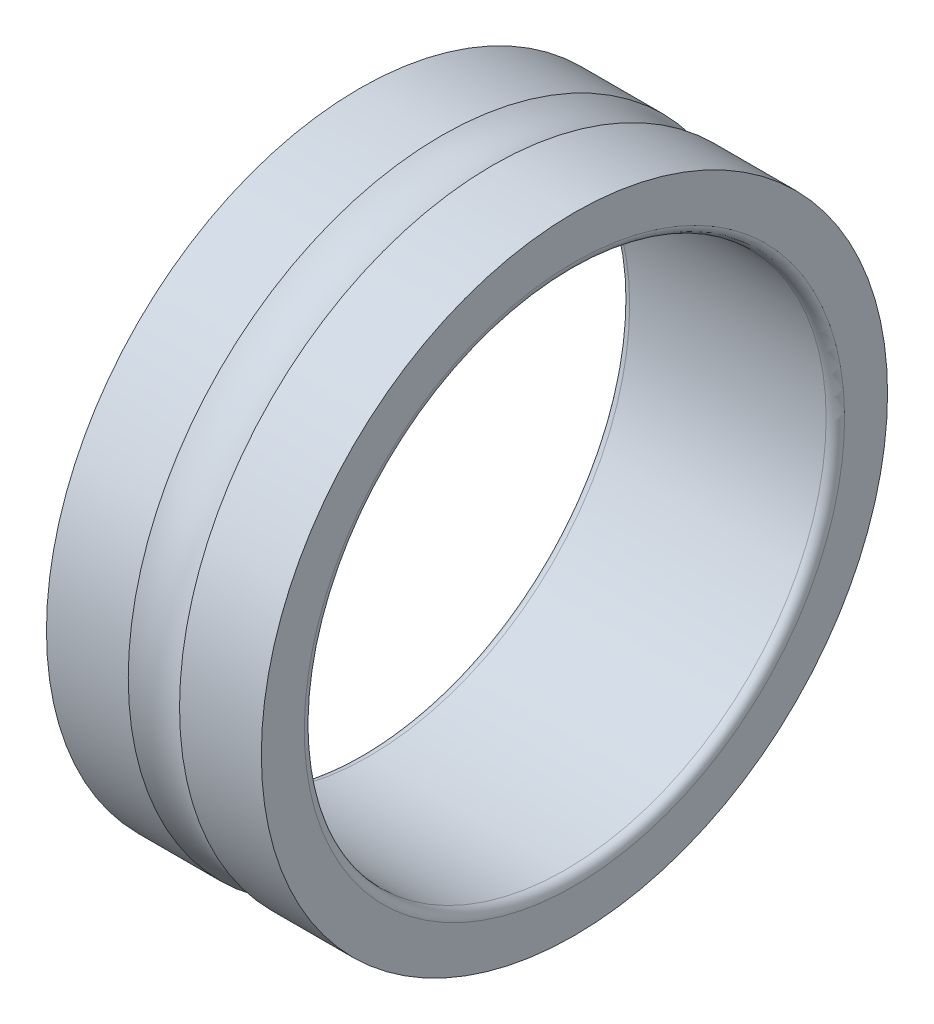
ISO-10303-21;
HEADER;
FILE_DESCRIPTION(('STEP AP214'),'2;1');
FILE_NAME('part.step','',(''),(''),'','','');
FILE_SCHEMA(('AUTOMOTIVE_DESIGN { 1 0 10303 214 1 1 1 1 }'));
ENDSEC;
DATA;
#1=APPLICATION_CONTEXT('core data for automotive mechanical design processes');
#2=APPLICATION_PROTOCOL_DEFINITION('international standard','automotive_design',2000,#1);
#3=PRODUCT_CONTEXT('',#1,'mechanical');
#4=PRODUCT('Part','Part','',(#3));
#5=PRODUCT_RELATED_PRODUCT_CATEGORY('part','',(#4));
#6=PRODUCT_DEFINITION_FORMATION('','',#4);
#7=PRODUCT_DEFINITION_CONTEXT('part definition',#1,'design');
#8=PRODUCT_DEFINITION('design','',#6,#7);
#9=PRODUCT_DEFINITION_SHAPE('','',#8);
#10=(LENGTH_UNIT() NAMED_UNIT(*) SI_UNIT(.MILLI.,.METRE.));
#11=(NAMED_UNIT(*) PLANE_ANGLE_UNIT() SI_UNIT($,.RADIAN.));
#12=(NAMED_UNIT(*) SI_UNIT($,.STERADIAN.) SOLID_ANGLE_UNIT());
#13=UNCERTAINTY_MEASURE_WITH_UNIT(LENGTH_MEASURE(1.E-05),#10,'distance_accuracy_value','');
#14=(GEOMETRIC_REPRESENTATION_CONTEXT(3) GLOBAL_UNCERTAINTY_ASSIGNED_CONTEXT((#13)) GLOBAL_UNIT_ASSIGNED_CONTEXT((#10,
#11,#12)) REPRESENTATION_CONTEXT('',''));
#15=CARTESIAN_POINT('',(0.,0.,0.));
#16=DIRECTION('',(0.,0.,1.));
#17=DIRECTION('',(1.,0.,0.));
#18=AXIS2_PLACEMENT_3D('',#15,#16,#17);
#19=CARTESIAN_POINT('',(5.66780385649249,0.,0.));
#20=DIRECTION('',(-1.,0.,0.));
#21=DIRECTION('',(0.,1.,0.));
#22=AXIS2_PLACEMENT_3D('',#19,#20,#21);
#23=CYLINDRICAL_SURFACE('',#22,10.2);
#24=CARTESIAN_POINT('',(4.33560771298498,0.,0.));
#25=DIRECTION('',(1.,0.,0.));
#26=DIRECTION('',(0.,1.,0.));
#27=AXIS2_PLACEMENT_3D('',#24,#25,#26);
#28=CIRCLE('',#27,10.2);
#29=CARTESIAN_POINT('',(4.33560771298498,10.2,0.));
#30=VERTEX_POINT('',#29);
#31=EDGE_CURVE('E11',#30,#30,#28,.T.);
#32=ORIENTED_EDGE('',*,*,#31,.T.);
#33=EDGE_LOOP('',(#32));
#34=FACE_BOUND('',#33,.T.);
#35=CARTESIAN_POINT('',(7.,0.,0.));
#36=DIRECTION('',(1.,0.,0.));
#37=DIRECTION('',(0.,1.,0.));
#38=AXIS2_PLACEMENT_3D('',#35,#36,#37);
#39=CIRCLE('',#38,10.2);
#40=CARTESIAN_POINT('',(7.,10.2,0.));
#41=VERTEX_POINT('',#40);
#42=EDGE_CURVE('E61',#41,#41,#39,.T.);
#43=ORIENTED_EDGE('',*,*,#42,.F.);
#44=EDGE_LOOP('',(#43));
#45=FACE_BOUND('',#44,.T.);
#46=ADVANCED_FACE('F16',(#34,#45),#23,.T.);
#47=CARTESIAN_POINT('',(3.5,0.,0.));
#48=DIRECTION('',(1.,0.,0.));
#49=DIRECTION('',(0.,0.,-1.));
#50=AXIS2_PLACEMENT_3D('',#47,#48,#49);
#51=TOROIDAL_SURFACE('',#50,12.,1.9845);
#52=CARTESIAN_POINT('',(2.66439228701502,0.,0.));
#53=DIRECTION('',(1.,0.,0.));
#54=DIRECTION('',(0.,1.,0.));
#55=AXIS2_PLACEMENT_3D('',#52,#53,#54);
#56=CIRCLE('',#55,10.2);
#57=CARTESIAN_POINT('',(2.66439228701502,10.2,0.));
#58=VERTEX_POINT('',#57);
#59=EDGE_CURVE('E20',#58,#58,#56,.T.);
#60=ORIENTED_EDGE('',*,*,#59,.T.);
#61=EDGE_LOOP('',(#60));
#62=FACE_BOUND('',#61,.T.);
#63=ORIENTED_EDGE('',*,*,#31,.F.);
#64=EDGE_LOOP('',(#63));
#65=FACE_BOUND('',#64,.T.);
#66=ADVANCED_FACE('F83',(#62,#65),#51,.F.);
#67=CARTESIAN_POINT('',(1.33219614350751,0.,0.));
#68=DIRECTION('',(-1.,0.,0.));
#69=DIRECTION('',(0.,1.,0.));
#70=AXIS2_PLACEMENT_3D('',#67,#68,#69);
#71=CYLINDRICAL_SURFACE('',#70,10.2);
#72=CARTESIAN_POINT('',(0.,0.,0.));
#73=DIRECTION('',(1.,0.,0.));
#74=DIRECTION('',(0.,1.,0.));
#75=AXIS2_PLACEMENT_3D('',#72,#73,#74);
#76=CIRCLE('',#75,10.2);
#77=CARTESIAN_POINT('',(0.,10.2,0.));
#78=VERTEX_POINT('',#77);
#79=EDGE_CURVE('E49',#78,#78,#76,.T.);
#80=ORIENTED_EDGE('',*,*,#79,.T.);
#81=EDGE_LOOP('',(#80));
#82=FACE_BOUND('',#81,.T.);
#83=ORIENTED_EDGE('',*,*,#59,.F.);
#84=EDGE_LOOP('',(#83));
#85=FACE_BOUND('',#84,.T.);
#86=ADVANCED_FACE('F50',(#82,#85),#71,.T.);
#87=CARTESIAN_POINT('',(0.,9.5,0.));
#88=DIRECTION('',(-1.,0.,0.));
#89=DIRECTION('',(0.,-1.,0.));
#90=AXIS2_PLACEMENT_3D('',#87,#88,#89);
#91=PLANE('',#90);
#92=CARTESIAN_POINT('',(0.,0.,0.));
#93=DIRECTION('',(1.,0.,0.));
#94=DIRECTION('',(0.,1.,0.));
#95=AXIS2_PLACEMENT_3D('',#92,#93,#94);
#96=CIRCLE('',#95,8.8);
#97=CARTESIAN_POINT('',(0.,8.8,0.));
#98=VERTEX_POINT('',#97);
#99=EDGE_CURVE('E53',#98,#98,#96,.T.);
#100=ORIENTED_EDGE('',*,*,#99,.T.);
#101=EDGE_LOOP('',(#100));
#102=FACE_BOUND('',#101,.T.);
#103=ORIENTED_EDGE('',*,*,#79,.F.);
#104=EDGE_LOOP('',(#103));
#105=FACE_BOUND('',#104,.T.);
#106=ADVANCED_FACE('F93',(#102,#105),#91,.T.);
#107=CARTESIAN_POINT('',(0.3,0.,0.));
#108=DIRECTION('',(1.,0.,0.));
#109=DIRECTION('',(0.,0.,-1.));
#110=AXIS2_PLACEMENT_3D('',#107,#108,#109);
#111=TOROIDAL_SURFACE('',#110,8.8,0.3);
#112=CARTESIAN_POINT('',(0.3,0.,0.));
#113=DIRECTION('',(1.,0.,0.));
#114=DIRECTION('',(0.,1.,0.));
#115=AXIS2_PLACEMENT_3D('',#112,#113,#114);
#116=CIRCLE('',#115,8.5);
#117=CARTESIAN_POINT('',(0.3,8.5,0.));
#118=VERTEX_POINT('',#117);
#119=EDGE_CURVE('E55',#118,#118,#116,.T.);
#120=ORIENTED_EDGE('',*,*,#119,.T.);
#121=EDGE_LOOP('',(#120));
#122=FACE_BOUND('',#121,.T.);
#123=ORIENTED_EDGE('',*,*,#99,.F.);
#124=EDGE_LOOP('',(#123));
#125=FACE_BOUND('',#124,.T.);
#126=ADVANCED_FACE('F18',(#122,#125),#111,.T.);
#127=CARTESIAN_POINT('',(3.5,0.,0.));
#128=DIRECTION('',(-1.,0.,0.));
#129=DIRECTION('',(0.,1.,0.));
#130=AXIS2_PLACEMENT_3D('',#127,#128,#129);
#131=CYLINDRICAL_SURFACE('',#130,8.5);
#132=CARTESIAN_POINT('',(6.7,0.,0.));
#133=DIRECTION('',(1.,0.,0.));
#134=DIRECTION('',(0.,1.,0.));
#135=AXIS2_PLACEMENT_3D('',#132,#133,#134);
#136=CIRCLE('',#135,8.5);
#137=CARTESIAN_POINT('',(6.7,8.5,0.));
#138=VERTEX_POINT('',#137);
#139=EDGE_CURVE('E60',#138,#138,#136,.T.);
#140=ORIENTED_EDGE('',*,*,#139,.T.);
#141=EDGE_LOOP('',(#140));
#142=FACE_BOUND('',#141,.T.);
#143=ORIENTED_EDGE('',*,*,#119,.F.);
#144=EDGE_LOOP('',(#143));
#145=FACE_BOUND('',#144,.T.);
#146=ADVANCED_FACE('F79',(#142,#145),#131,.F.);
#147=CARTESIAN_POINT('',(6.7,0.,0.));
#148=DIRECTION('',(1.,0.,0.));
#149=DIRECTION('',(0.,0.,-1.));
#150=AXIS2_PLACEMENT_3D('',#147,#148,#149);
#151=TOROIDAL_SURFACE('',#150,8.8,0.3);
#152=CARTESIAN_POINT('',(7.,0.,0.));
#153=DIRECTION('',(1.,0.,0.));
#154=DIRECTION('',(0.,1.,0.));
#155=AXIS2_PLACEMENT_3D('',#152,#153,#154);
#156=CIRCLE('',#155,8.8);
#157=CARTESIAN_POINT('',(7.,8.8,0.));
#158=VERTEX_POINT('',#157);
#159=EDGE_CURVE('E58',#158,#158,#156,.T.);
#160=ORIENTED_EDGE('',*,*,#159,.T.);
#161=EDGE_LOOP('',(#160));
#162=FACE_BOUND('',#161,.T.);
#163=ORIENTED_EDGE('',*,*,#139,.F.);
#164=EDGE_LOOP('',(#163));
#165=FACE_BOUND('',#164,.T.);
#166=ADVANCED_FACE('F70',(#162,#165),#151,.T.);
#167=CARTESIAN_POINT('',(7.,9.5,0.));
#168=DIRECTION('',(1.,0.,0.));
#169=DIRECTION('',(0.,1.,0.));
#170=AXIS2_PLACEMENT_3D('',#167,#168,#169);
#171=PLANE('',#170);
#172=ORIENTED_EDGE('',*,*,#42,.T.);
#173=EDGE_LOOP('',(#172));
#174=FACE_BOUND('',#173,.T.);
#175=ORIENTED_EDGE('',*,*,#159,.F.);
#176=EDGE_LOOP('',(#175));
#177=FACE_BOUND('',#176,.T.);
#178=ADVANCED_FACE('F73',(#174,#177),#171,.T.);
#179=CLOSED_SHELL('',(#46,#66,#86,#106,#126,#146,#166,#178));
#180=MANIFOLD_SOLID_BREP('B1',#179);
#181=ADVANCED_BREP_SHAPE_REPRESENTATION('',(#18,#180),#14);
#182=SHAPE_DEFINITION_REPRESENTATION(#9,#181);
ENDSEC;
END-ISO-10303-21;
